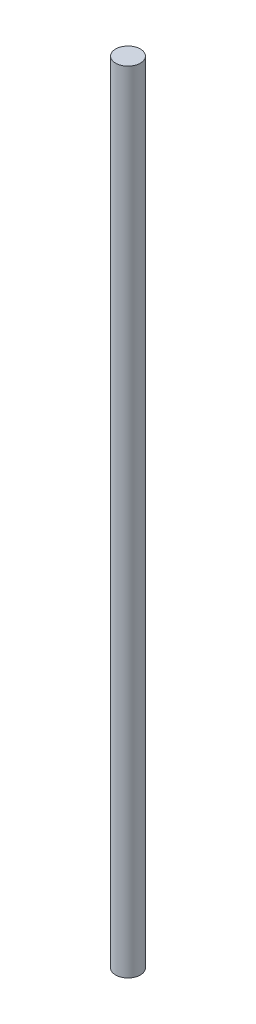
ISO-10303-21;
HEADER;
FILE_DESCRIPTION(('STEP AP214'),'2;1');
FILE_NAME('part.step','',(''),(''),'','','');
FILE_SCHEMA(('AUTOMOTIVE_DESIGN { 1 0 10303 214 1 1 1 1 }'));
ENDSEC;
DATA;
#1=APPLICATION_CONTEXT('core data for automotive mechanical design processes');
#2=APPLICATION_PROTOCOL_DEFINITION('international standard','automotive_design',2000,#1);
#3=PRODUCT_CONTEXT('',#1,'mechanical');
#4=PRODUCT('Part','Part','',(#3));
#5=PRODUCT_RELATED_PRODUCT_CATEGORY('part','',(#4));
#6=PRODUCT_DEFINITION_FORMATION('','',#4);
#7=PRODUCT_DEFINITION_CONTEXT('part definition',#1,'design');
#8=PRODUCT_DEFINITION('design','',#6,#7);
#9=PRODUCT_DEFINITION_SHAPE('','',#8);
#10=(LENGTH_UNIT() NAMED_UNIT(*) SI_UNIT(.MILLI.,.METRE.));
#11=(NAMED_UNIT(*) PLANE_ANGLE_UNIT() SI_UNIT($,.RADIAN.));
#12=(NAMED_UNIT(*) SI_UNIT($,.STERADIAN.) SOLID_ANGLE_UNIT());
#13=UNCERTAINTY_MEASURE_WITH_UNIT(LENGTH_MEASURE(1.E-05),#10,'distance_accuracy_value','');
#14=(GEOMETRIC_REPRESENTATION_CONTEXT(3) GLOBAL_UNCERTAINTY_ASSIGNED_CONTEXT((#13)) GLOBAL_UNIT_ASSIGNED_CONTEXT((#10,
#11,#12)) REPRESENTATION_CONTEXT('',''));
#15=CARTESIAN_POINT('',(0.,0.,0.));
#16=DIRECTION('',(0.,0.,1.));
#17=DIRECTION('',(1.,0.,0.));
#18=AXIS2_PLACEMENT_3D('',#15,#16,#17);
#19=CARTESIAN_POINT('',(0.,406.4,0.));
#20=DIRECTION('',(0.,-1.,0.));
#21=DIRECTION('',(0.,0.,-1.));
#22=AXIS2_PLACEMENT_3D('',#19,#20,#21);
#23=CYLINDRICAL_SURFACE('',#22,6.35);
#24=CARTESIAN_POINT('',(0.,406.4,0.));
#25=DIRECTION('',(0.,1.,0.));
#26=DIRECTION('',(0.,0.,1.));
#27=AXIS2_PLACEMENT_3D('',#24,#25,#26);
#28=CIRCLE('',#27,6.35);
#29=CARTESIAN_POINT('',(0.,406.4,6.35));
#30=VERTEX_POINT('',#29);
#31=EDGE_CURVE('E10',#30,#30,#28,.T.);
#32=ORIENTED_EDGE('',*,*,#31,.F.);
#33=EDGE_LOOP('',(#32));
#34=FACE_BOUND('',#33,.T.);
#35=CARTESIAN_POINT('',(0.,0.,0.));
#36=DIRECTION('',(0.,1.,0.));
#37=DIRECTION('',(0.,0.,1.));
#38=AXIS2_PLACEMENT_3D('',#35,#36,#37);
#39=CIRCLE('',#38,6.35);
#40=CARTESIAN_POINT('',(0.,0.,6.35));
#41=VERTEX_POINT('',#40);
#42=EDGE_CURVE('E37',#41,#41,#39,.T.);
#43=ORIENTED_EDGE('',*,*,#42,.T.);
#44=EDGE_LOOP('',(#43));
#45=FACE_BOUND('',#44,.T.);
#46=ADVANCED_FACE('F34',(#34,#45),#23,.T.);
#47=CARTESIAN_POINT('',(0.,406.4,0.));
#48=DIRECTION('',(0.,1.,0.));
#49=DIRECTION('',(0.,0.,1.));
#50=AXIS2_PLACEMENT_3D('',#47,#48,#49);
#51=PLANE('',#50);
#52=ORIENTED_EDGE('',*,*,#31,.T.);
#53=EDGE_LOOP('',(#52));
#54=FACE_BOUND('',#53,.T.);
#55=ADVANCED_FACE('F49',(#54),#51,.T.);
#56=CARTESIAN_POINT('',(0.,0.,0.));
#57=DIRECTION('',(0.,1.,0.));
#58=DIRECTION('',(0.,0.,1.));
#59=AXIS2_PLACEMENT_3D('',#56,#57,#58);
#60=PLANE('',#59);
#61=ORIENTED_EDGE('',*,*,#42,.F.);
#62=EDGE_LOOP('',(#61));
#63=FACE_BOUND('',#62,.T.);
#64=ADVANCED_FACE('F47',(#63),#60,.F.);
#65=CLOSED_SHELL('',(#46,#55,#64));
#66=MANIFOLD_SOLID_BREP('B2',#65);
#67=ADVANCED_BREP_SHAPE_REPRESENTATION('',(#18,#66),#14);
#68=SHAPE_DEFINITION_REPRESENTATION(#9,#67);
ENDSEC;
END-ISO-10303-21;
